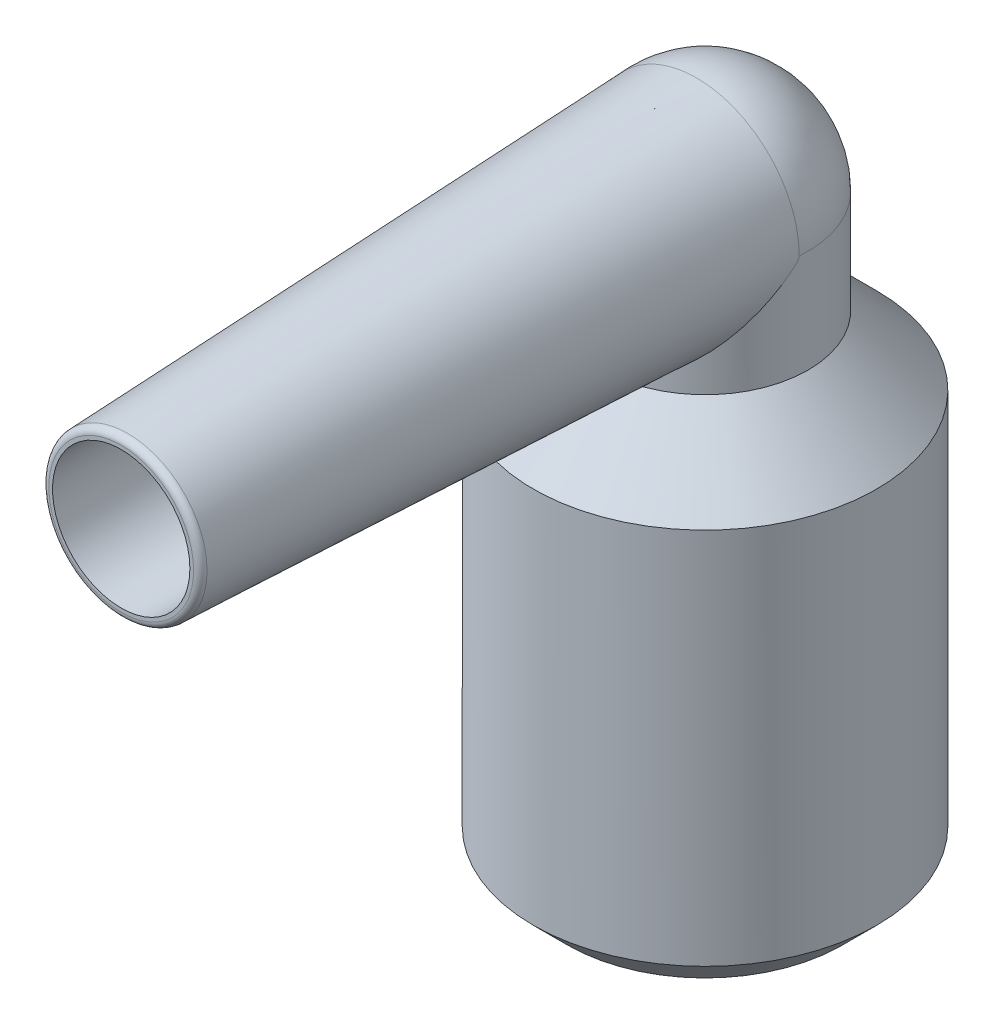
ISO-10303-21;
HEADER;
FILE_DESCRIPTION(('STEP AP214'),'2;1');
FILE_NAME('part.step','',(''),(''),'','','');
FILE_SCHEMA(('AUTOMOTIVE_DESIGN { 1 0 10303 214 1 1 1 1 }'));
ENDSEC;
DATA;
#1=APPLICATION_CONTEXT('core data for automotive mechanical design processes');
#2=APPLICATION_PROTOCOL_DEFINITION('international standard','automotive_design',2000,#1);
#3=PRODUCT_CONTEXT('',#1,'mechanical');
#4=PRODUCT('Part','Part','',(#3));
#5=PRODUCT_RELATED_PRODUCT_CATEGORY('part','',(#4));
#6=PRODUCT_DEFINITION_FORMATION('','',#4);
#7=PRODUCT_DEFINITION_CONTEXT('part definition',#1,'design');
#8=PRODUCT_DEFINITION('design','',#6,#7);
#9=PRODUCT_DEFINITION_SHAPE('','',#8);
#10=(LENGTH_UNIT() NAMED_UNIT(*) SI_UNIT(.MILLI.,.METRE.));
#11=(NAMED_UNIT(*) PLANE_ANGLE_UNIT() SI_UNIT($,.RADIAN.));
#12=(NAMED_UNIT(*) SI_UNIT($,.STERADIAN.) SOLID_ANGLE_UNIT());
#13=UNCERTAINTY_MEASURE_WITH_UNIT(LENGTH_MEASURE(1.E-05),#10,'distance_accuracy_value','');
#14=(GEOMETRIC_REPRESENTATION_CONTEXT(3) GLOBAL_UNCERTAINTY_ASSIGNED_CONTEXT((#13)) GLOBAL_UNIT_ASSIGNED_CONTEXT((#10,
#11,#12)) REPRESENTATION_CONTEXT('',''));
#15=CARTESIAN_POINT('',(0.,0.,0.));
#16=DIRECTION('',(0.,0.,1.));
#17=DIRECTION('',(1.,0.,0.));
#18=AXIS2_PLACEMENT_3D('',#15,#16,#17);
#19=CARTESIAN_POINT('',(0.,8.5,0.));
#20=DIRECTION('',(0.,0.,1.));
#21=DIRECTION('',(1.,0.,0.));
#22=AXIS2_PLACEMENT_3D('',#19,#20,#21);
#23=CYLINDRICAL_SURFACE('',#22,1.);
#24=CARTESIAN_POINT('',(0.,8.5,8.5));
#25=DIRECTION('',(0.,0.,1.));
#26=DIRECTION('',(1.,0.,0.));
#27=AXIS2_PLACEMENT_3D('',#24,#25,#26);
#28=CIRCLE('',#27,1.);
#29=CARTESIAN_POINT('',(1.,8.5,8.5));
#30=VERTEX_POINT('',#29);
#31=EDGE_CURVE('E91',#30,#30,#28,.T.);
#32=ORIENTED_EDGE('',*,*,#31,.T.);
#33=EDGE_LOOP('',(#32));
#34=FACE_BOUND('',#33,.T.);
#35=DIRECTION('',(0.,0.,1.));
#36=VECTOR('',#35,1.);
#37=CARTESIAN_POINT('',(1.,8.5,0.));
#38=LINE('',#37,#36);
#39=CARTESIAN_POINT('',(1.,8.5,0.75));
#40=VERTEX_POINT('',#39);
#41=CARTESIAN_POINT('',(1.,8.5,0.));
#42=VERTEX_POINT('',#41);
#43=EDGE_CURVE('E55',#40,#42,#38,.F.);
#44=ORIENTED_EDGE('',*,*,#43,.F.);
#45=CARTESIAN_POINT('',(1.,8.5,0.75));
#46=CARTESIAN_POINT('',(1.00004239994648,8.46198702337239,0.74987067623704));
#47=CARTESIAN_POINT('',(0.997836474983587,8.42417248440612,0.752891030049957));
#48=CARTESIAN_POINT('',(0.989402301671297,8.35025495975449,0.763974595843188));
#49=CARTESIAN_POINT('',(0.983229346307377,8.31413566085111,0.771968438600678));
#50=CARTESIAN_POINT('',(0.964471732244662,8.23129262126803,0.79534501534317));
#51=CARTESIAN_POINT('',(0.950384680660608,8.18538761384483,0.812346903541743));
#52=CARTESIAN_POINT('',(0.916522193316678,8.09721509419316,0.850379422724849));
#53=CARTESIAN_POINT('',(0.896705010558025,8.05497734782898,0.871439227838412));
#54=CARTESIAN_POINT('',(0.843872960776307,7.95979884696953,0.923139211942924));
#55=CARTESIAN_POINT('',(0.808674279042956,7.90846117237922,0.954504023368436));
#56=CARTESIAN_POINT('',(0.72926217117743,7.81296480895968,1.0164732592259));
#57=CARTESIAN_POINT('',(0.685065973845453,7.76879268545021,1.04707901332387));
#58=CARTESIAN_POINT('',(0.597383815759072,7.69645045071011,1.09895111616673));
#59=CARTESIAN_POINT('',(0.555474703797678,7.66684234987058,1.12086929566955));
#60=CARTESIAN_POINT('',(0.466231173247665,7.61382140520423,1.16082242902013));
#61=CARTESIAN_POINT('',(0.418904323224981,7.59040006628811,1.17886270124157));
#62=CARTESIAN_POINT('',(0.327657998123034,7.55414329746643,1.20707838724441));
#63=CARTESIAN_POINT('',(0.284425664917521,7.54020835317978,1.2180539649432));
#64=CARTESIAN_POINT('',(0.19559283887621,7.51825044435389,1.23542973000579));
#65=CARTESIAN_POINT('',(0.149993718545759,7.51022409352002,1.24183253802269));
#66=CARTESIAN_POINT('',(0.0575240307640956,7.500570938951,1.24953985523491));
#67=CARTESIAN_POINT('',(0.0106496069422996,7.49896639439046,1.25082663121042));
#68=CARTESIAN_POINT('',(-0.0827084607393283,7.50233214675648,1.24813465733429));
#69=CARTESIAN_POINT('',(-0.129192088757806,7.50730270893161,1.24415569505575));
#70=CARTESIAN_POINT('',(-0.21784075294766,7.52303381063528,1.23164197425201));
#71=CARTESIAN_POINT('',(-0.260103069944624,7.53346391056774,1.22336742128652));
#72=CARTESIAN_POINT('',(-0.342084024447002,7.5593468737367,1.20302304698824));
#73=CARTESIAN_POINT('',(-0.381801894313003,7.57480124429276,1.19095208673974));
#74=CARTESIAN_POINT('',(-0.461768671333841,7.61180267814838,1.16242932183417));
#75=CARTESIAN_POINT('',(-0.501699422986384,7.63379356974987,1.14566730645162));
#76=CARTESIAN_POINT('',(-0.577363035500912,7.6822752521992,1.10946555279252));
#77=CARTESIAN_POINT('',(-0.613094541131812,7.70876748906546,1.09002495442489));
#78=CARTESIAN_POINT('',(-0.68710962302099,7.77151161629767,1.04528145200122));
#79=CARTESIAN_POINT('',(-0.724408177137867,7.80865029305065,1.0195949170613));
#80=CARTESIAN_POINT('',(-0.79265669582179,7.88807912738569,0.967491938383681));
#81=CARTESIAN_POINT('',(-0.823591452247026,7.93038124913856,0.941073913470941));
#82=CARTESIAN_POINT('',(-0.876199052099705,8.01570358199046,0.892154182393672));
#83=CARTESIAN_POINT('',(-0.898471959775693,8.05827542696115,0.869518644115187));
#84=CARTESIAN_POINT('',(-0.937018513226683,8.14738533198993,0.827824809865524));
#85=CARTESIAN_POINT('',(-0.95333126354885,8.19389497950176,0.808743614557609));
#86=CARTESIAN_POINT('',(-0.977028295888454,8.28285705861986,0.779878657807463));
#87=CARTESIAN_POINT('',(-0.985453607049307,8.32467350429644,0.769070255857841));
#88=CARTESIAN_POINT('',(-0.994079660457727,8.38915205984456,0.757844645867823));
#89=CARTESIAN_POINT('',(-0.99628744460861,8.4111222592943,0.754931225091592));
#90=CARTESIAN_POINT('',(-0.999252642595954,8.45538699481208,0.750996973623874));
#91=CARTESIAN_POINT('',(-1.0000060605793,8.47768225535265,0.749981357370733));
#92=CARTESIAN_POINT('',(-1.00000000000001,8.50000000000001,0.750000000000043));
#93=B_SPLINE_CURVE_WITH_KNOTS('',3,(#45,#46,#47,#48,#49,#50,#51,#52,#53,#54,#55,#56,#57,#58,#59,
#60,#61,#62,#63,#64,#65,#66,#67,#68,#69,#70,#71,#72,#73,#74,#75,#76,#77,#78,#79,#80,#81,#82,#83,
#84,#85,#86,#87,#88,#89,#90,#91,#92),.UNSPECIFIED.,.F.,.F.,(4,2,2,2,2,2,2,2,2,2,2,2,2,2,2,2,2,2,
2,2,2,2,2,4),(0.,0.113538161589317,0.225527159749816,0.377504713372878,0.530618672369755,
0.738714715684918,0.94641597433343,1.11318075129621,1.27971533775768,1.41931198339593,
1.55882856189424,1.69882831414268,1.83883371433993,1.97120612225622,2.10361827960957,
2.24879963014769,2.39402770742754,2.56910640453789,2.74459876318906,2.90345202850738,
3.06124350350388,3.19245916340866,3.25915499815905,3.32603381952746),.UNSPECIFIED.);
#94=CARTESIAN_POINT('',(-1.,8.5,0.75));
#95=VERTEX_POINT('',#94);
#96=EDGE_CURVE('E77',#40,#95,#93,.T.);
#97=ORIENTED_EDGE('',*,*,#96,.T.);
#98=DIRECTION('',(0.,0.,1.));
#99=VECTOR('',#98,1.);
#100=CARTESIAN_POINT('',(-1.,8.5,0.));
#101=LINE('',#100,#99);
#102=CARTESIAN_POINT('',(-1.,8.5,0.));
#103=VERTEX_POINT('',#102);
#104=EDGE_CURVE('E86',#103,#95,#101,.T.);
#105=ORIENTED_EDGE('',*,*,#104,.F.);
#106=CARTESIAN_POINT('',(0.,8.5,0.));
#107=DIRECTION('',(0.,0.,1.));
#108=DIRECTION('',(1.,0.,0.));
#109=AXIS2_PLACEMENT_3D('',#106,#107,#108);
#110=CIRCLE('',#109,1.);
#111=EDGE_CURVE('E90',#42,#103,#110,.T.);
#112=ORIENTED_EDGE('',*,*,#111,.F.);
#113=EDGE_LOOP('',(#44,#97,#105,#112));
#114=FACE_BOUND('',#113,.T.);
#115=ADVANCED_FACE('F40',(#34,#114),#23,.F.);
#116=CARTESIAN_POINT('',(0.,8.5,0.));
#117=DIRECTION('',(0.,0.,1.));
#118=DIRECTION('',(1.,0.,0.));
#119=AXIS2_PLACEMENT_3D('',#116,#117,#118);
#120=PLANE('',#119);
#121=ORIENTED_EDGE('',*,*,#111,.T.);
#122=DIRECTION('',(1.,0.,0.));
#123=VECTOR('',#122,1.);
#124=CARTESIAN_POINT('',(0.,8.5,0.));
#125=LINE('',#124,#123);
#126=EDGE_CURVE('E83',#103,#42,#125,.T.);
#127=ORIENTED_EDGE('',*,*,#126,.T.);
#128=EDGE_LOOP('',(#121,#127));
#129=FACE_BOUND('',#128,.T.);
#130=ADVANCED_FACE('F131',(#129),#120,.T.);
#131=CARTESIAN_POINT('',(0.,6.,0.));
#132=DIRECTION('',(0.,-1.,0.));
#133=DIRECTION('',(0.,0.,-1.));
#134=AXIS2_PLACEMENT_3D('',#131,#132,#133);
#135=CYLINDRICAL_SURFACE('',#134,2.5);
#136=CARTESIAN_POINT('',(0.,0.499999999999999,0.));
#137=DIRECTION('',(0.,1.,0.));
#138=DIRECTION('',(0.,0.,1.));
#139=AXIS2_PLACEMENT_3D('',#136,#137,#138);
#140=CIRCLE('',#139,2.5);
#141=CARTESIAN_POINT('',(0.,0.499999999999999,2.5));
#142=VERTEX_POINT('',#141);
#143=EDGE_CURVE('E82',#142,#142,#140,.T.);
#144=ORIENTED_EDGE('',*,*,#143,.T.);
#145=EDGE_LOOP('',(#144));
#146=FACE_BOUND('',#145,.T.);
#147=CARTESIAN_POINT('',(0.,6.,0.));
#148=DIRECTION('',(0.,-1.,0.));
#149=DIRECTION('',(0.,0.,-1.));
#150=AXIS2_PLACEMENT_3D('',#147,#148,#149);
#151=CIRCLE('',#150,2.5);
#152=CARTESIAN_POINT('',(0.,6.,-2.5));
#153=VERTEX_POINT('',#152);
#154=EDGE_CURVE('E276',#153,#153,#151,.F.);
#155=ORIENTED_EDGE('',*,*,#154,.F.);
#156=EDGE_LOOP('',(#155));
#157=FACE_BOUND('',#156,.T.);
#158=ADVANCED_FACE('F127',(#146,#157),#135,.T.);
#159=CARTESIAN_POINT('',(0.,0.,0.));
#160=DIRECTION('',(0.,1.,0.));
#161=DIRECTION('',(0.,0.,1.));
#162=AXIS2_PLACEMENT_3D('',#159,#160,#161);
#163=PLANE('',#162);
#164=CARTESIAN_POINT('',(0.,0.,0.));
#165=DIRECTION('',(0.,1.,0.));
#166=DIRECTION('',(0.,0.,1.));
#167=AXIS2_PLACEMENT_3D('',#164,#165,#166);
#168=CIRCLE('',#167,2.);
#169=CARTESIAN_POINT('',(0.,0.,2.));
#170=VERTEX_POINT('',#169);
#171=EDGE_CURVE('E297',#170,#170,#168,.F.);
#172=ORIENTED_EDGE('',*,*,#171,.T.);
#173=EDGE_LOOP('',(#172));
#174=FACE_BOUND('',#173,.T.);
#175=CARTESIAN_POINT('',(0.,0.,0.));
#176=DIRECTION('',(0.,1.,0.));
#177=DIRECTION('',(0.,0.,1.));
#178=AXIS2_PLACEMENT_3D('',#175,#176,#177);
#179=CIRCLE('',#178,1.75);
#180=CARTESIAN_POINT('',(0.,0.,1.75));
#181=VERTEX_POINT('',#180);
#182=EDGE_CURVE('E301',#181,#181,#179,.T.);
#183=ORIENTED_EDGE('',*,*,#182,.T.);
#184=EDGE_LOOP('',(#183));
#185=FACE_BOUND('',#184,.T.);
#186=ADVANCED_FACE('F122',(#174,#185),#163,.F.);
#187=CARTESIAN_POINT('',(0.,7.,0.));
#188=DIRECTION('',(0.,-1.,0.));
#189=DIRECTION('',(0.,0.,-1.));
#190=AXIS2_PLACEMENT_3D('',#187,#188,#189);
#191=CONICAL_SURFACE('',#190,1.5,0.785398163397448);
#192=ORIENTED_EDGE('',*,*,#154,.T.);
#193=EDGE_LOOP('',(#192));
#194=FACE_BOUND('',#193,.T.);
#195=CARTESIAN_POINT('',(0.,7.,0.));
#196=DIRECTION('',(0.,1.,0.));
#197=DIRECTION('',(0.,0.,1.));
#198=AXIS2_PLACEMENT_3D('',#195,#196,#197);
#199=CIRCLE('',#198,1.5);
#200=CARTESIAN_POINT('',(0.,7.,1.5));
#201=VERTEX_POINT('',#200);
#202=EDGE_CURVE('E104',#201,#201,#199,.T.);
#203=ORIENTED_EDGE('',*,*,#202,.F.);
#204=EDGE_LOOP('',(#203));
#205=FACE_BOUND('',#204,.T.);
#206=ADVANCED_FACE('F111',(#194,#205),#191,.T.);
#207=CARTESIAN_POINT('',(0.,8.5,0.));
#208=DIRECTION('',(0.,-1.,0.));
#209=DIRECTION('',(-1.,0.,0.));
#210=AXIS2_PLACEMENT_3D('',#207,#208,#209);
#211=SPHERICAL_SURFACE('',#210,1.5);
#212=CARTESIAN_POINT('',(0.,8.5,0.));
#213=DIRECTION('',(0.,-1.,0.));
#214=DIRECTION('',(0.,0.,-1.));
#215=AXIS2_PLACEMENT_3D('',#212,#213,#214);
#216=CIRCLE('',#215,1.5);
#217=CARTESIAN_POINT('',(-1.49492210439048,8.5,0.123320321945504));
#218=VERTEX_POINT('',#217);
#219=CARTESIAN_POINT('',(1.49492210439048,8.5,0.123320321945499));
#220=VERTEX_POINT('',#219);
#221=EDGE_CURVE('E62',#218,#220,#216,.T.);
#222=ORIENTED_EDGE('',*,*,#221,.F.);
#223=CARTESIAN_POINT('',(0.,8.5,0.123320321944195));
#224=DIRECTION('',(0.,0.,-1.));
#225=DIRECTION('',(-1.,0.,0.));
#226=AXIS2_PLACEMENT_3D('',#223,#224,#225);
#227=CIRCLE('',#226,1.49492210439053);
#228=EDGE_CURVE('E97',#218,#220,#227,.T.);
#229=ORIENTED_EDGE('',*,*,#228,.T.);
#230=EDGE_LOOP('',(#222,#229));
#231=FACE_BOUND('',#230,.T.);
#232=ADVANCED_FACE('F121',(#231),#211,.T.);
#233=CARTESIAN_POINT('',(0.,8.5,0.));
#234=DIRECTION('',(0.,-1.,0.));
#235=DIRECTION('',(0.,0.,-1.));
#236=AXIS2_PLACEMENT_3D('',#233,#234,#235);
#237=CYLINDRICAL_SURFACE('',#236,1.5);
#238=ORIENTED_EDGE('',*,*,#202,.T.);
#239=EDGE_LOOP('',(#238));
#240=FACE_BOUND('',#239,.T.);
#241=ORIENTED_EDGE('',*,*,#221,.T.);
#242=CARTESIAN_POINT('',(1.49492207767856,8.50020000000013,0.123320645754174));
#243=CARTESIAN_POINT('',(1.49492513148001,8.49558676813378,0.123276317057244));
#244=CARTESIAN_POINT('',(1.49488203802973,8.49102731216569,0.123806854996394));
#245=CARTESIAN_POINT('',(1.49472418372137,8.48219773818891,0.125701892694194));
#246=CARTESIAN_POINT('',(1.4946112543932,8.47792322579913,0.127045061322751));
#247=CARTESIAN_POINT('',(1.49415914150509,8.4644280458799,0.132288811266861));
#248=CARTESIAN_POINT('',(1.49371332795999,8.45567639005071,0.137291236596335));
#249=CARTESIAN_POINT('',(1.49265691350547,8.4386823252932,0.148353440638018));
#250=CARTESIAN_POINT('',(1.49204264865853,8.43045695843815,0.154435519540445));
#251=CARTESIAN_POINT('',(1.4898429396506,8.40432407118421,0.174830665454629));
#252=CARTESIAN_POINT('',(1.48799933220076,8.38708913079753,0.189978443323004));
#253=CARTESIAN_POINT('',(1.48375358591704,8.353102330254,0.220733885863181));
#254=CARTESIAN_POINT('',(1.48135050122017,8.33635134279801,0.236342289813333));
#255=CARTESIAN_POINT('',(1.47337453285461,8.28682379101049,0.283115765845594));
#256=CARTESIAN_POINT('',(1.46700198773596,8.25441691766222,0.31454759502869));
#257=CARTESIAN_POINT('',(1.44717844148036,8.16869942416857,0.398207878099079));
#258=CARTESIAN_POINT('',(1.43183623173486,8.11578486997262,0.450398390832853));
#259=CARTESIAN_POINT('',(1.39505763728843,8.01114376165142,0.553927780381577));
#260=CARTESIAN_POINT('',(1.37361561538363,7.95941835450387,0.605265822711143));
#261=CARTESIAN_POINT('',(1.32432602534607,7.85740378678556,0.706645354231982));
#262=CARTESIAN_POINT('',(1.29645914810361,7.80711948003122,0.756682418633668));
#263=CARTESIAN_POINT('',(1.23407985466235,7.70873694697355,0.854643855585737));
#264=CARTESIAN_POINT('',(1.19957291198642,7.66063696018421,0.902569928550367));
#265=CARTESIAN_POINT('',(1.11570472647452,7.55765595523069,1.00521512592087));
#266=CARTESIAN_POINT('',(1.06474782475026,7.50341941367231,1.05929963133272));
#267=CARTESIAN_POINT('',(0.952145957403658,7.40091282773375,1.16154244621387));
#268=CARTESIAN_POINT('',(0.890524718527042,7.35262993721583,1.20971351401616));
#269=CARTESIAN_POINT('',(0.768776790020905,7.27249422379038,1.2896742421185));
#270=CARTESIAN_POINT('',(0.710482909286413,7.23925434142919,1.32284578677741));
#271=CARTESIAN_POINT('',(0.586997795926387,7.17991693114086,1.38206527548151));
#272=CARTESIAN_POINT('',(0.521813812035158,7.1538119985832,1.40812060469417));
#273=CARTESIAN_POINT('',(0.396822428616008,7.11406569526892,1.44779290533245));
#274=CARTESIAN_POINT('',(0.337867785019063,7.09908702808846,1.46274438439741));
#275=CARTESIAN_POINT('',(0.217236133428934,7.07633886634697,1.48545161481372));
#276=CARTESIAN_POINT('',(0.155560865651589,7.06856483151167,1.49321189797155));
#277=CARTESIAN_POINT('',(0.0310557096434567,7.06078477790449,1.50097818897417));
#278=CARTESIAN_POINT('',(-0.0317768763278301,7.06080007426288,1.50096291939277));
#279=CARTESIAN_POINT('',(-0.156455477612234,7.06865086115462,1.49312602079884));
#280=CARTESIAN_POINT('',(-0.218301321643677,7.07648769468738,1.48530305116282));
#281=CARTESIAN_POINT('',(-0.336876909835381,7.09895132475221,1.46287984657154));
#282=CARTESIAN_POINT('',(-0.393711990632287,7.11330428676162,1.44855293523011));
#283=CARTESIAN_POINT('',(-0.503693252717758,7.1478420615739,1.41407939063962));
#284=CARTESIAN_POINT('',(-0.556838183769395,7.16802883905374,1.39393079680008));
#285=CARTESIAN_POINT('',(-0.679293704812489,7.22241322808454,1.33965270023379));
#286=CARTESIAN_POINT('',(-0.746506661502286,7.25898027833564,1.3031596178714));
#287=CARTESIAN_POINT('',(-0.871725998013879,7.33934520485027,1.22296848211674));
#288=CARTESIAN_POINT('',(-0.929709273545481,7.38316068415008,1.17925288897577));
#289=CARTESIAN_POINT('',(-1.05666215636644,7.49360096941535,1.06908917951857));
#290=CARTESIAN_POINT('',(-1.12151582727335,7.56259222337191,1.00028937413955));
#291=CARTESIAN_POINT('',(-1.23483486078054,7.70688058984505,0.856485095523456));
#292=CARTESIAN_POINT('',(-1.28330612905585,7.78217541775395,0.781482870351994));
#293=CARTESIAN_POINT('',(-1.34526843761486,7.89927337613736,0.665025802132924));
#294=CARTESIAN_POINT('',(-1.36432377899814,7.93961054330629,0.624941103200723));
#295=CARTESIAN_POINT('',(-1.398578463075,8.02120892311797,0.543977714191694));
#296=CARTESIAN_POINT('',(-1.41377448319928,8.06247089891776,0.503098372361738));
#297=CARTESIAN_POINT('',(-1.43570852175202,8.13110166807298,0.435345666201782));
#298=CARTESIAN_POINT('',(-1.44354191580349,8.15825516140882,0.408600660356811));
#299=CARTESIAN_POINT('',(-1.45759786423936,8.21271861008118,0.355197751739484));
#300=CARTESIAN_POINT('',(-1.463830196355,8.24002652160741,0.32854035191318));
#301=CARTESIAN_POINT('',(-1.47247875417873,8.28360402337079,0.286454465491799));
#302=CARTESIAN_POINT('',(-1.47540248278164,8.29972737311942,0.270979583553592));
#303=CARTESIAN_POINT('',(-1.48077386344012,8.33252130452874,0.239923093181685));
#304=CARTESIAN_POINT('',(-1.48321164586069,8.34919648638825,0.224344855825826));
#305=CARTESIAN_POINT('',(-1.48758912857785,8.38344435619576,0.193198681173467));
#306=CARTESIAN_POINT('',(-1.48951504596523,8.40102903834725,0.177640493608423));
#307=CARTESIAN_POINT('',(-1.49187303856703,8.42822481428821,0.156095488442398));
#308=CARTESIAN_POINT('',(-1.49256089732878,8.43722229056756,0.149341687844714));
#309=CARTESIAN_POINT('',(-1.49373865638123,8.45600379261098,0.137041001425971));
#310=CARTESIAN_POINT('',(-1.49423112929146,8.46577541331853,0.131478907307678));
#311=CARTESIAN_POINT('',(-1.49460981158854,8.47814189826507,0.127051632175409));
#312=CARTESIAN_POINT('',(-1.49466228636627,8.48006306531332,0.126431705869041));
#313=CARTESIAN_POINT('',(-1.49475385469097,8.48394885900629,0.125344259853473));
#314=CARTESIAN_POINT('',(-1.4947929470059,8.48591348963479,0.124876754177148));
#315=CARTESIAN_POINT('',(-1.49488957051024,8.49194132366845,0.123716446116065));
#316=CARTESIAN_POINT('',(-1.49492384397381,8.49605729117544,0.123296794412922));
#317=CARTESIAN_POINT('',(-1.49492207767856,8.50020000000015,0.123320645754213));
#318=B_SPLINE_CURVE_WITH_KNOTS('',3,(#242,#243,#244,#245,#246,#247,#248,#249,#250,#251,#252,
#253,#254,#255,#256,#257,#258,#259,#260,#261,#262,#263,#264,#265,#266,#267,#268,#269,#270,#271,
#272,#273,#274,#275,#276,#277,#278,#279,#280,#281,#282,#283,#284,#285,#286,#287,#288,#289,#290,
#291,#292,#293,#294,#295,#296,#297,#298,#299,#300,#301,#302,#303,#304,#305,#306,#307,#308,#309,
#310,#311,#312,#313,#314,#315,#316,#317),.UNSPECIFIED.,.F.,.F.,(4,2,2,2,2,2,2,2,2,2,2,2,2,2,2,2,
2,2,2,2,2,2,2,2,2,2,2,2,2,2,2,2,2,2,2,2,2,4),(0.,0.0137206697093135,0.0270959232067411,
0.0571265918362653,0.0878708452485458,0.156827069997381,0.22590073105532,0.362613553490092,
0.590030082468673,0.817657467349316,1.04597808761909,1.27411129924525,1.5492434177959,
1.82377109351948,2.04750710847431,2.27101004149649,2.45812052058656,2.6451130045195,
2.83261718713554,3.02015357075359,3.2004493918814,3.38080600284156,3.63371886523762,
3.88725520231198,4.23650380653699,4.5856263758811,4.76544029785082,4.94540850453884,
5.06210903224444,5.17807894931759,5.24568274170359,5.31454432504527,5.38510601168186,
5.41894154401651,5.45231547626117,5.45836735592097,5.4644197926005,5.47678136479081),.UNSPECIFIED.);
#319=EDGE_CURVE('E269',#220,#218,#318,.T.);
#320=ORIENTED_EDGE('',*,*,#319,.T.);
#321=EDGE_LOOP('',(#241,#320));
#322=FACE_BOUND('',#321,.T.);
#323=ADVANCED_FACE('F201',(#240,#322),#237,.T.);
#324=CARTESIAN_POINT('',(0.,8.5,8.5));
#325=DIRECTION('',(0.,0.,-1.));
#326=DIRECTION('',(-1.,0.,0.));
#327=AXIS2_PLACEMENT_3D('',#324,#325,#326);
#328=CONICAL_SURFACE('',#327,1.15,0.041153222641443);
#329=CARTESIAN_POINT('',(0.,8.5,8.40411416075262));
#330=DIRECTION('',(0.,0.,1.));
#331=DIRECTION('',(1.,0.,0.));
#332=AXIS2_PLACEMENT_3D('',#329,#330,#331);
#333=CIRCLE('',#332,1.1539482404396);
#334=CARTESIAN_POINT('',(1.1539482404396,8.5,8.40411416075262));
#335=VERTEX_POINT('',#334);
#336=EDGE_CURVE('E12',#335,#335,#333,.F.);
#337=ORIENTED_EDGE('',*,*,#336,.T.);
#338=EDGE_LOOP('',(#337));
#339=FACE_BOUND('',#338,.T.);
#340=ORIENTED_EDGE('',*,*,#228,.F.);
#341=ORIENTED_EDGE('',*,*,#319,.F.);
#342=EDGE_LOOP('',(#340,#341));
#343=FACE_BOUND('',#342,.T.);
#344=ADVANCED_FACE('F156',(#339,#343),#328,.T.);
#345=CARTESIAN_POINT('',(0.,8.5,8.5));
#346=DIRECTION('',(0.,0.,1.));
#347=DIRECTION('',(1.,0.,0.));
#348=AXIS2_PLACEMENT_3D('',#345,#346,#347);
#349=PLANE('',#348);
#350=CARTESIAN_POINT('',(0.,8.5,8.5));
#351=DIRECTION('',(0.,0.,1.));
#352=DIRECTION('',(1.,0.,0.));
#353=AXIS2_PLACEMENT_3D('',#350,#351,#352);
#354=CIRCLE('',#353,1.05403290787596);
#355=CARTESIAN_POINT('',(1.05403290787596,8.5,8.5));
#356=VERTEX_POINT('',#355);
#357=EDGE_CURVE('E48',#356,#356,#354,.T.);
#358=ORIENTED_EDGE('',*,*,#357,.T.);
#359=EDGE_LOOP('',(#358));
#360=FACE_BOUND('',#359,.T.);
#361=ORIENTED_EDGE('',*,*,#31,.F.);
#362=EDGE_LOOP('',(#361));
#363=FACE_BOUND('',#362,.T.);
#364=ADVANCED_FACE('F170',(#360,#363),#349,.T.);
#365=CARTESIAN_POINT('',(0.,8.5,0.));
#366=DIRECTION('',(0.,-1.,0.));
#367=DIRECTION('',(0.,0.,-1.));
#368=AXIS2_PLACEMENT_3D('',#365,#366,#367);
#369=CYLINDRICAL_SURFACE('',#368,1.25);
#370=CARTESIAN_POINT('',(0.,0.499999999999999,0.));
#371=DIRECTION('',(0.,1.,0.));
#372=DIRECTION('',(0.,0.,1.));
#373=AXIS2_PLACEMENT_3D('',#370,#371,#372);
#374=CIRCLE('',#373,1.25);
#375=CARTESIAN_POINT('',(0.,0.499999999999999,1.25));
#376=VERTEX_POINT('',#375);
#377=EDGE_CURVE('E295',#376,#376,#374,.F.);
#378=ORIENTED_EDGE('',*,*,#377,.T.);
#379=EDGE_LOOP('',(#378));
#380=FACE_BOUND('',#379,.T.);
#381=CARTESIAN_POINT('',(0.,8.5,0.));
#382=DIRECTION('',(0.,-1.,0.));
#383=DIRECTION('',(0.,0.,-1.));
#384=AXIS2_PLACEMENT_3D('',#381,#382,#383);
#385=CIRCLE('',#384,1.25);
#386=EDGE_CURVE('E79',#95,#40,#385,.T.);
#387=ORIENTED_EDGE('',*,*,#386,.F.);
#388=ORIENTED_EDGE('',*,*,#96,.F.);
#389=EDGE_LOOP('',(#387,#388));
#390=FACE_BOUND('',#389,.T.);
#391=ADVANCED_FACE('F78',(#380,#390),#369,.F.);
#392=CARTESIAN_POINT('',(0.,8.5,0.));
#393=DIRECTION('',(0.,-1.,0.));
#394=DIRECTION('',(0.,0.,-1.));
#395=AXIS2_PLACEMENT_3D('',#392,#393,#394);
#396=PLANE('',#395);
#397=ORIENTED_EDGE('',*,*,#43,.T.);
#398=ORIENTED_EDGE('',*,*,#126,.F.);
#399=ORIENTED_EDGE('',*,*,#104,.T.);
#400=ORIENTED_EDGE('',*,*,#386,.T.);
#401=EDGE_LOOP('',(#397,#398,#399,#400));
#402=FACE_BOUND('',#401,.T.);
#403=ADVANCED_FACE('F85',(#402),#396,.T.);
#404=CARTESIAN_POINT('',(0.,0.499999999999999,0.));
#405=DIRECTION('',(0.,1.,0.));
#406=DIRECTION('',(0.,0.,1.));
#407=AXIS2_PLACEMENT_3D('',#404,#405,#406);
#408=CONICAL_SURFACE('',#407,2.5,0.78539816339745);
#409=ORIENTED_EDGE('',*,*,#171,.F.);
#410=EDGE_LOOP('',(#409));
#411=FACE_BOUND('',#410,.T.);
#412=ORIENTED_EDGE('',*,*,#143,.F.);
#413=EDGE_LOOP('',(#412));
#414=FACE_BOUND('',#413,.T.);
#415=ADVANCED_FACE('F133',(#411,#414),#408,.T.);
#416=CARTESIAN_POINT('',(0.,0.499999999999999,0.));
#417=DIRECTION('',(0.,-1.,0.));
#418=DIRECTION('',(0.,0.,-1.));
#419=AXIS2_PLACEMENT_3D('',#416,#417,#418);
#420=CONICAL_SURFACE('',#419,1.25,0.785398163397451);
#421=ORIENTED_EDGE('',*,*,#182,.F.);
#422=EDGE_LOOP('',(#421));
#423=FACE_BOUND('',#422,.T.);
#424=ORIENTED_EDGE('',*,*,#377,.F.);
#425=EDGE_LOOP('',(#424));
#426=FACE_BOUND('',#425,.T.);
#427=ADVANCED_FACE('F135',(#423,#426),#420,.F.);
#428=CARTESIAN_POINT('',(0.,8.5,8.4));
#429=DIRECTION('',(0.,0.,1.));
#430=DIRECTION('',(1.,0.,0.));
#431=AXIS2_PLACEMENT_3D('',#428,#429,#430);
#432=TOROIDAL_SURFACE('',#431,1.05403290787596,0.1);
#433=ORIENTED_EDGE('',*,*,#336,.F.);
#434=EDGE_LOOP('',(#433));
#435=FACE_BOUND('',#434,.T.);
#436=ORIENTED_EDGE('',*,*,#357,.F.);
#437=EDGE_LOOP('',(#436));
#438=FACE_BOUND('',#437,.T.);
#439=ADVANCED_FACE('F42',(#435,#438),#432,.T.);
#440=CLOSED_SHELL('',(#115,#130,#158,#186,#206,#232,#323,#344,#364,#391,#403,#415,#427,#439));
#441=MANIFOLD_SOLID_BREP('B2',#440);
#442=ADVANCED_BREP_SHAPE_REPRESENTATION('',(#18,#441),#14);
#443=SHAPE_DEFINITION_REPRESENTATION(#9,#442);
ENDSEC;
END-ISO-10303-21;
